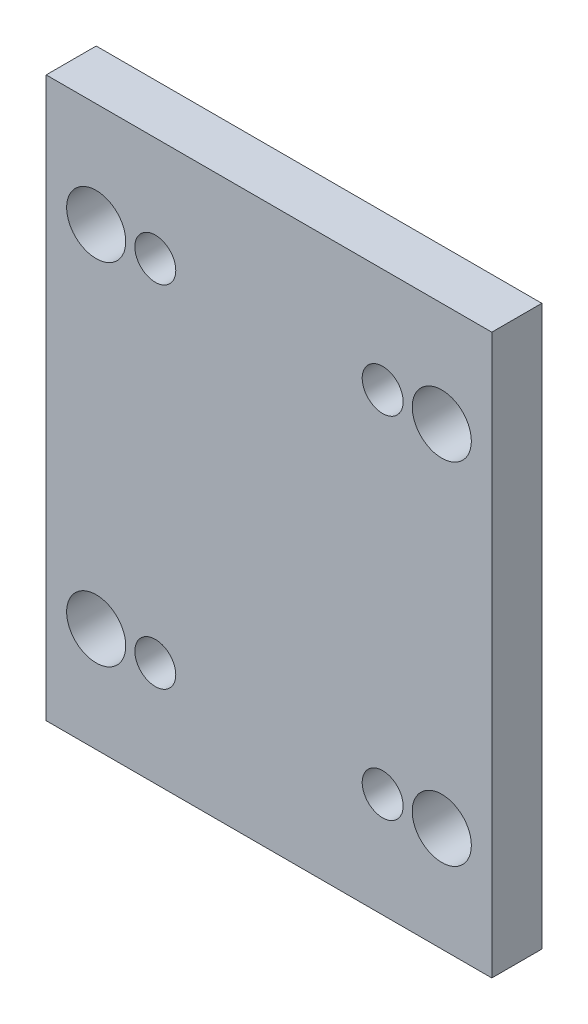
ISO-10303-21;
HEADER;
FILE_DESCRIPTION(('STEP AP214'),'2;1');
FILE_NAME('part.step','',(''),(''),'','','');
FILE_SCHEMA(('AUTOMOTIVE_DESIGN { 1 0 10303 214 1 1 1 1 }'));
ENDSEC;
DATA;
#1=APPLICATION_CONTEXT('core data for automotive mechanical design processes');
#2=APPLICATION_PROTOCOL_DEFINITION('international standard','automotive_design',2000,#1);
#3=PRODUCT_CONTEXT('',#1,'mechanical');
#4=PRODUCT('Part','Part','',(#3));
#5=PRODUCT_RELATED_PRODUCT_CATEGORY('part','',(#4));
#6=PRODUCT_DEFINITION_FORMATION('','',#4);
#7=PRODUCT_DEFINITION_CONTEXT('part definition',#1,'design');
#8=PRODUCT_DEFINITION('design','',#6,#7);
#9=PRODUCT_DEFINITION_SHAPE('','',#8);
#10=(LENGTH_UNIT() NAMED_UNIT(*) SI_UNIT(.MILLI.,.METRE.));
#11=(NAMED_UNIT(*) PLANE_ANGLE_UNIT() SI_UNIT($,.RADIAN.));
#12=(NAMED_UNIT(*) SI_UNIT($,.STERADIAN.) SOLID_ANGLE_UNIT());
#13=UNCERTAINTY_MEASURE_WITH_UNIT(LENGTH_MEASURE(1.E-05),#10,'distance_accuracy_value','');
#14=(GEOMETRIC_REPRESENTATION_CONTEXT(3) GLOBAL_UNCERTAINTY_ASSIGNED_CONTEXT((#13)) GLOBAL_UNIT_ASSIGNED_CONTEXT((#10,
#11,#12)) REPRESENTATION_CONTEXT('',''));
#15=CARTESIAN_POINT('',(0.,0.,0.));
#16=DIRECTION('',(0.,0.,1.));
#17=DIRECTION('',(1.,0.,0.));
#18=AXIS2_PLACEMENT_3D('',#15,#16,#17);
#19=CARTESIAN_POINT('',(98.,-123.,0.));
#20=DIRECTION('',(1.,0.,0.));
#21=DIRECTION('',(0.,0.,-1.));
#22=AXIS2_PLACEMENT_3D('',#19,#20,#21);
#23=PLANE('',#22);
#24=DIRECTION('',(0.,1.,0.));
#25=VECTOR('',#24,1.);
#26=CARTESIAN_POINT('',(98.,-123.,22.));
#27=LINE('',#26,#25);
#28=CARTESIAN_POINT('',(98.,-123.,22.));
#29=VERTEX_POINT('',#28);
#30=CARTESIAN_POINT('',(98.,123.,22.));
#31=VERTEX_POINT('',#30);
#32=EDGE_CURVE('E102',#29,#31,#27,.T.);
#33=ORIENTED_EDGE('',*,*,#32,.F.);
#34=DIRECTION('',(0.,0.,1.));
#35=VECTOR('',#34,1.);
#36=CARTESIAN_POINT('',(98.,-123.,0.));
#37=LINE('',#36,#35);
#38=CARTESIAN_POINT('',(98.,-123.,0.));
#39=VERTEX_POINT('',#38);
#40=EDGE_CURVE('E11',#39,#29,#37,.T.);
#41=ORIENTED_EDGE('',*,*,#40,.F.);
#42=DIRECTION('',(0.,1.,0.));
#43=VECTOR('',#42,1.);
#44=CARTESIAN_POINT('',(98.,-123.,0.));
#45=LINE('',#44,#43);
#46=CARTESIAN_POINT('',(98.,123.,0.));
#47=VERTEX_POINT('',#46);
#48=EDGE_CURVE('E95',#39,#47,#45,.T.);
#49=ORIENTED_EDGE('',*,*,#48,.T.);
#50=DIRECTION('',(0.,0.,1.));
#51=VECTOR('',#50,1.);
#52=CARTESIAN_POINT('',(98.,123.,0.));
#53=LINE('',#52,#51);
#54=EDGE_CURVE('E40',#47,#31,#53,.T.);
#55=ORIENTED_EDGE('',*,*,#54,.T.);
#56=EDGE_LOOP('',(#33,#41,#49,#55));
#57=FACE_BOUND('',#56,.T.);
#58=ADVANCED_FACE('F37',(#57),#23,.T.);
#59=CARTESIAN_POINT('',(-98.,-123.,0.));
#60=DIRECTION('',(0.,-1.,0.));
#61=DIRECTION('',(0.,0.,-1.));
#62=AXIS2_PLACEMENT_3D('',#59,#60,#61);
#63=PLANE('',#62);
#64=DIRECTION('',(1.,0.,0.));
#65=VECTOR('',#64,1.);
#66=CARTESIAN_POINT('',(-98.,-123.,22.));
#67=LINE('',#66,#65);
#68=CARTESIAN_POINT('',(-98.,-123.,22.));
#69=VERTEX_POINT('',#68);
#70=EDGE_CURVE('E97',#69,#29,#67,.T.);
#71=ORIENTED_EDGE('',*,*,#70,.F.);
#72=DIRECTION('',(0.,0.,1.));
#73=VECTOR('',#72,1.);
#74=CARTESIAN_POINT('',(-98.,-123.,0.));
#75=LINE('',#74,#73);
#76=CARTESIAN_POINT('',(-98.,-123.,0.));
#77=VERTEX_POINT('',#76);
#78=EDGE_CURVE('E46',#77,#69,#75,.T.);
#79=ORIENTED_EDGE('',*,*,#78,.F.);
#80=DIRECTION('',(1.,0.,0.));
#81=VECTOR('',#80,1.);
#82=CARTESIAN_POINT('',(-98.,-123.,0.));
#83=LINE('',#82,#81);
#84=EDGE_CURVE('E92',#77,#39,#83,.T.);
#85=ORIENTED_EDGE('',*,*,#84,.T.);
#86=ORIENTED_EDGE('',*,*,#40,.T.);
#87=EDGE_LOOP('',(#71,#79,#85,#86));
#88=FACE_BOUND('',#87,.T.);
#89=ADVANCED_FACE('F113',(#88),#63,.T.);
#90=CARTESIAN_POINT('',(-98.,123.,0.));
#91=DIRECTION('',(-1.,0.,0.));
#92=DIRECTION('',(0.,0.,1.));
#93=AXIS2_PLACEMENT_3D('',#90,#91,#92);
#94=PLANE('',#93);
#95=DIRECTION('',(0.,-1.,0.));
#96=VECTOR('',#95,1.);
#97=CARTESIAN_POINT('',(-98.,123.,22.));
#98=LINE('',#97,#96);
#99=CARTESIAN_POINT('',(-98.,123.,22.));
#100=VERTEX_POINT('',#99);
#101=EDGE_CURVE('E87',#100,#69,#98,.T.);
#102=ORIENTED_EDGE('',*,*,#101,.F.);
#103=DIRECTION('',(0.,0.,1.));
#104=VECTOR('',#103,1.);
#105=CARTESIAN_POINT('',(-98.,123.,0.));
#106=LINE('',#105,#104);
#107=CARTESIAN_POINT('',(-98.,123.,0.));
#108=VERTEX_POINT('',#107);
#109=EDGE_CURVE('E82',#108,#100,#106,.T.);
#110=ORIENTED_EDGE('',*,*,#109,.F.);
#111=DIRECTION('',(0.,-1.,0.));
#112=VECTOR('',#111,1.);
#113=CARTESIAN_POINT('',(-98.,123.,0.));
#114=LINE('',#113,#112);
#115=EDGE_CURVE('E85',#108,#77,#114,.T.);
#116=ORIENTED_EDGE('',*,*,#115,.T.);
#117=ORIENTED_EDGE('',*,*,#78,.T.);
#118=EDGE_LOOP('',(#102,#110,#116,#117));
#119=FACE_BOUND('',#118,.T.);
#120=ADVANCED_FACE('F84',(#119),#94,.T.);
#121=CARTESIAN_POINT('',(98.,123.,0.));
#122=DIRECTION('',(0.,1.,0.));
#123=DIRECTION('',(0.,0.,1.));
#124=AXIS2_PLACEMENT_3D('',#121,#122,#123);
#125=PLANE('',#124);
#126=DIRECTION('',(-1.,0.,0.));
#127=VECTOR('',#126,1.);
#128=CARTESIAN_POINT('',(98.,123.,22.));
#129=LINE('',#128,#127);
#130=EDGE_CURVE('E105',#31,#100,#129,.T.);
#131=ORIENTED_EDGE('',*,*,#130,.F.);
#132=ORIENTED_EDGE('',*,*,#54,.F.);
#133=DIRECTION('',(-1.,0.,0.));
#134=VECTOR('',#133,1.);
#135=CARTESIAN_POINT('',(98.,123.,0.));
#136=LINE('',#135,#134);
#137=EDGE_CURVE('E91',#47,#108,#136,.T.);
#138=ORIENTED_EDGE('',*,*,#137,.T.);
#139=ORIENTED_EDGE('',*,*,#109,.T.);
#140=EDGE_LOOP('',(#131,#132,#138,#139));
#141=FACE_BOUND('',#140,.T.);
#142=ADVANCED_FACE('F94',(#141),#125,.T.);
#143=CARTESIAN_POINT('',(0.,0.,0.));
#144=DIRECTION('',(0.,0.,1.));
#145=DIRECTION('',(1.,0.,0.));
#146=AXIS2_PLACEMENT_3D('',#143,#144,#145);
#147=PLANE('',#146);
#148=CARTESIAN_POINT('',(76.,77.,0.));
#149=DIRECTION('',(0.,0.,1.));
#150=DIRECTION('',(1.,0.,0.));
#151=AXIS2_PLACEMENT_3D('',#148,#149,#150);
#152=CIRCLE('',#151,13.);
#153=CARTESIAN_POINT('',(89.,77.,0.));
#154=VERTEX_POINT('',#153);
#155=EDGE_CURVE('E202',#154,#154,#152,.T.);
#156=ORIENTED_EDGE('',*,*,#155,.T.);
#157=EDGE_LOOP('',(#156));
#158=FACE_BOUND('',#157,.T.);
#159=CARTESIAN_POINT('',(76.,-77.,0.));
#160=DIRECTION('',(0.,0.,1.));
#161=DIRECTION('',(1.,0.,0.));
#162=AXIS2_PLACEMENT_3D('',#159,#160,#161);
#163=CIRCLE('',#162,13.);
#164=CARTESIAN_POINT('',(89.,-77.,0.));
#165=VERTEX_POINT('',#164);
#166=EDGE_CURVE('E212',#165,#165,#163,.T.);
#167=ORIENTED_EDGE('',*,*,#166,.T.);
#168=EDGE_LOOP('',(#167));
#169=FACE_BOUND('',#168,.T.);
#170=CARTESIAN_POINT('',(-76.,-77.,0.));
#171=DIRECTION('',(0.,0.,1.));
#172=DIRECTION('',(1.,0.,0.));
#173=AXIS2_PLACEMENT_3D('',#170,#171,#172);
#174=CIRCLE('',#173,13.);
#175=CARTESIAN_POINT('',(-63.,-77.,0.));
#176=VERTEX_POINT('',#175);
#177=EDGE_CURVE('E218',#176,#176,#174,.T.);
#178=ORIENTED_EDGE('',*,*,#177,.T.);
#179=EDGE_LOOP('',(#178));
#180=FACE_BOUND('',#179,.T.);
#181=CARTESIAN_POINT('',(-76.,77.,0.));
#182=DIRECTION('',(0.,0.,1.));
#183=DIRECTION('',(1.,0.,0.));
#184=AXIS2_PLACEMENT_3D('',#181,#182,#183);
#185=CIRCLE('',#184,13.);
#186=CARTESIAN_POINT('',(-63.,77.,0.));
#187=VERTEX_POINT('',#186);
#188=EDGE_CURVE('E224',#187,#187,#185,.T.);
#189=ORIENTED_EDGE('',*,*,#188,.T.);
#190=EDGE_LOOP('',(#189));
#191=FACE_BOUND('',#190,.T.);
#192=CARTESIAN_POINT('',(50.,77.,0.));
#193=DIRECTION('',(0.,0.,1.));
#194=DIRECTION('',(1.,0.,0.));
#195=AXIS2_PLACEMENT_3D('',#192,#193,#194);
#196=CIRCLE('',#195,5.50000000000001);
#197=CARTESIAN_POINT('',(55.5,77.,0.));
#198=VERTEX_POINT('',#197);
#199=EDGE_CURVE('E236',#198,#198,#196,.T.);
#200=ORIENTED_EDGE('',*,*,#199,.T.);
#201=EDGE_LOOP('',(#200));
#202=FACE_BOUND('',#201,.T.);
#203=CARTESIAN_POINT('',(50.,-77.,0.));
#204=DIRECTION('',(0.,0.,1.));
#205=DIRECTION('',(1.,0.,0.));
#206=AXIS2_PLACEMENT_3D('',#203,#204,#205);
#207=CIRCLE('',#206,5.50000000000001);
#208=CARTESIAN_POINT('',(55.5,-77.,0.));
#209=VERTEX_POINT('',#208);
#210=EDGE_CURVE('E248',#209,#209,#207,.T.);
#211=ORIENTED_EDGE('',*,*,#210,.T.);
#212=EDGE_LOOP('',(#211));
#213=FACE_BOUND('',#212,.T.);
#214=CARTESIAN_POINT('',(-50.,77.,0.));
#215=DIRECTION('',(0.,0.,1.));
#216=DIRECTION('',(1.,0.,0.));
#217=AXIS2_PLACEMENT_3D('',#214,#215,#216);
#218=CIRCLE('',#217,5.50000000000001);
#219=CARTESIAN_POINT('',(-44.5,77.,0.));
#220=VERTEX_POINT('',#219);
#221=EDGE_CURVE('E260',#220,#220,#218,.T.);
#222=ORIENTED_EDGE('',*,*,#221,.T.);
#223=EDGE_LOOP('',(#222));
#224=FACE_BOUND('',#223,.T.);
#225=CARTESIAN_POINT('',(-50.,-77.,0.));
#226=DIRECTION('',(0.,0.,1.));
#227=DIRECTION('',(1.,0.,0.));
#228=AXIS2_PLACEMENT_3D('',#225,#226,#227);
#229=CIRCLE('',#228,5.50000000000001);
#230=CARTESIAN_POINT('',(-44.5,-77.,0.));
#231=VERTEX_POINT('',#230);
#232=EDGE_CURVE('E106',#231,#231,#229,.T.);
#233=ORIENTED_EDGE('',*,*,#232,.T.);
#234=EDGE_LOOP('',(#233));
#235=FACE_BOUND('',#234,.T.);
#236=ORIENTED_EDGE('',*,*,#48,.F.);
#237=ORIENTED_EDGE('',*,*,#84,.F.);
#238=ORIENTED_EDGE('',*,*,#115,.F.);
#239=ORIENTED_EDGE('',*,*,#137,.F.);
#240=EDGE_LOOP('',(#236,#237,#238,#239));
#241=FACE_BOUND('',#240,.T.);
#242=ADVANCED_FACE('F90',(#158,#169,#180,#191,#202,#213,#224,#235,#241),#147,.F.);
#243=CARTESIAN_POINT('',(0.,0.,22.));
#244=DIRECTION('',(0.,0.,1.));
#245=DIRECTION('',(1.,0.,0.));
#246=AXIS2_PLACEMENT_3D('',#243,#244,#245);
#247=PLANE('',#246);
#248=CARTESIAN_POINT('',(76.,77.,22.));
#249=DIRECTION('',(0.,0.,1.));
#250=DIRECTION('',(1.,0.,0.));
#251=AXIS2_PLACEMENT_3D('',#248,#249,#250);
#252=CIRCLE('',#251,13.);
#253=CARTESIAN_POINT('',(89.,77.,22.));
#254=VERTEX_POINT('',#253);
#255=EDGE_CURVE('E205',#254,#254,#252,.T.);
#256=ORIENTED_EDGE('',*,*,#255,.F.);
#257=EDGE_LOOP('',(#256));
#258=FACE_BOUND('',#257,.T.);
#259=CARTESIAN_POINT('',(76.,-77.,22.));
#260=DIRECTION('',(0.,0.,1.));
#261=DIRECTION('',(1.,0.,0.));
#262=AXIS2_PLACEMENT_3D('',#259,#260,#261);
#263=CIRCLE('',#262,13.);
#264=CARTESIAN_POINT('',(89.,-77.,22.));
#265=VERTEX_POINT('',#264);
#266=EDGE_CURVE('E207',#265,#265,#263,.T.);
#267=ORIENTED_EDGE('',*,*,#266,.F.);
#268=EDGE_LOOP('',(#267));
#269=FACE_BOUND('',#268,.T.);
#270=CARTESIAN_POINT('',(-76.,-77.,22.));
#271=DIRECTION('',(0.,0.,1.));
#272=DIRECTION('',(1.,0.,0.));
#273=AXIS2_PLACEMENT_3D('',#270,#271,#272);
#274=CIRCLE('',#273,13.);
#275=CARTESIAN_POINT('',(-63.,-77.,22.));
#276=VERTEX_POINT('',#275);
#277=EDGE_CURVE('E215',#276,#276,#274,.T.);
#278=ORIENTED_EDGE('',*,*,#277,.F.);
#279=EDGE_LOOP('',(#278));
#280=FACE_BOUND('',#279,.T.);
#281=CARTESIAN_POINT('',(-76.,77.,22.));
#282=DIRECTION('',(0.,0.,1.));
#283=DIRECTION('',(1.,0.,0.));
#284=AXIS2_PLACEMENT_3D('',#281,#282,#283);
#285=CIRCLE('',#284,13.);
#286=CARTESIAN_POINT('',(-63.,77.,22.));
#287=VERTEX_POINT('',#286);
#288=EDGE_CURVE('E221',#287,#287,#285,.T.);
#289=ORIENTED_EDGE('',*,*,#288,.F.);
#290=EDGE_LOOP('',(#289));
#291=FACE_BOUND('',#290,.T.);
#292=CARTESIAN_POINT('',(50.,77.,22.));
#293=DIRECTION('',(0.,0.,1.));
#294=DIRECTION('',(1.,0.,0.));
#295=AXIS2_PLACEMENT_3D('',#292,#293,#294);
#296=CIRCLE('',#295,8.99999999999999);
#297=CARTESIAN_POINT('',(59.,77.,22.));
#298=VERTEX_POINT('',#297);
#299=EDGE_CURVE('E227',#298,#298,#296,.T.);
#300=ORIENTED_EDGE('',*,*,#299,.F.);
#301=EDGE_LOOP('',(#300));
#302=FACE_BOUND('',#301,.T.);
#303=CARTESIAN_POINT('',(50.,-77.,22.));
#304=DIRECTION('',(0.,0.,1.));
#305=DIRECTION('',(1.,0.,0.));
#306=AXIS2_PLACEMENT_3D('',#303,#304,#305);
#307=CIRCLE('',#306,8.99999999999999);
#308=CARTESIAN_POINT('',(59.,-77.,22.));
#309=VERTEX_POINT('',#308);
#310=EDGE_CURVE('E239',#309,#309,#307,.T.);
#311=ORIENTED_EDGE('',*,*,#310,.F.);
#312=EDGE_LOOP('',(#311));
#313=FACE_BOUND('',#312,.T.);
#314=CARTESIAN_POINT('',(-50.,77.,22.));
#315=DIRECTION('',(0.,0.,1.));
#316=DIRECTION('',(1.,0.,0.));
#317=AXIS2_PLACEMENT_3D('',#314,#315,#316);
#318=CIRCLE('',#317,8.99999999999999);
#319=CARTESIAN_POINT('',(-41.,77.,22.));
#320=VERTEX_POINT('',#319);
#321=EDGE_CURVE('E251',#320,#320,#318,.T.);
#322=ORIENTED_EDGE('',*,*,#321,.F.);
#323=EDGE_LOOP('',(#322));
#324=FACE_BOUND('',#323,.T.);
#325=CARTESIAN_POINT('',(-50.,-77.,22.));
#326=DIRECTION('',(0.,0.,1.));
#327=DIRECTION('',(1.,0.,0.));
#328=AXIS2_PLACEMENT_3D('',#325,#326,#327);
#329=CIRCLE('',#328,8.99999999999999);
#330=CARTESIAN_POINT('',(-41.,-77.,22.));
#331=VERTEX_POINT('',#330);
#332=EDGE_CURVE('E263',#331,#331,#329,.T.);
#333=ORIENTED_EDGE('',*,*,#332,.F.);
#334=EDGE_LOOP('',(#333));
#335=FACE_BOUND('',#334,.T.);
#336=ORIENTED_EDGE('',*,*,#32,.T.);
#337=ORIENTED_EDGE('',*,*,#130,.T.);
#338=ORIENTED_EDGE('',*,*,#101,.T.);
#339=ORIENTED_EDGE('',*,*,#70,.T.);
#340=EDGE_LOOP('',(#336,#337,#338,#339));
#341=FACE_BOUND('',#340,.T.);
#342=ADVANCED_FACE('F112',(#258,#269,#280,#291,#302,#313,#324,#335,#341),#247,.T.);
#343=CARTESIAN_POINT('',(-50.,-77.,22.));
#344=DIRECTION('',(0.,0.,1.));
#345=DIRECTION('',(1.,0.,0.));
#346=AXIS2_PLACEMENT_3D('',#343,#344,#345);
#347=CYLINDRICAL_SURFACE('',#346,5.50000000000001);
#348=ORIENTED_EDGE('',*,*,#232,.F.);
#349=EDGE_LOOP('',(#348));
#350=FACE_BOUND('',#349,.T.);
#351=CARTESIAN_POINT('',(-50.,-77.,9.));
#352=DIRECTION('',(0.,0.,1.));
#353=DIRECTION('',(1.,0.,0.));
#354=AXIS2_PLACEMENT_3D('',#351,#352,#353);
#355=CIRCLE('',#354,5.50000000000001);
#356=CARTESIAN_POINT('',(-44.5,-77.,9.));
#357=VERTEX_POINT('',#356);
#358=EDGE_CURVE('E269',#357,#357,#355,.T.);
#359=ORIENTED_EDGE('',*,*,#358,.T.);
#360=EDGE_LOOP('',(#359));
#361=FACE_BOUND('',#360,.T.);
#362=ADVANCED_FACE('F131',(#350,#361),#347,.F.);
#363=CARTESIAN_POINT('',(-44.5,-77.,9.));
#364=DIRECTION('',(0.,0.,-1.));
#365=DIRECTION('',(-1.,0.,0.));
#366=AXIS2_PLACEMENT_3D('',#363,#364,#365);
#367=PLANE('',#366);
#368=ORIENTED_EDGE('',*,*,#358,.F.);
#369=EDGE_LOOP('',(#368));
#370=FACE_BOUND('',#369,.T.);
#371=CARTESIAN_POINT('',(-50.,-77.,9.));
#372=DIRECTION('',(0.,0.,1.));
#373=DIRECTION('',(1.,0.,0.));
#374=AXIS2_PLACEMENT_3D('',#371,#372,#373);
#375=CIRCLE('',#374,8.99999999999999);
#376=CARTESIAN_POINT('',(-41.,-77.,9.));
#377=VERTEX_POINT('',#376);
#378=EDGE_CURVE('E266',#377,#377,#375,.T.);
#379=ORIENTED_EDGE('',*,*,#378,.T.);
#380=EDGE_LOOP('',(#379));
#381=FACE_BOUND('',#380,.T.);
#382=ADVANCED_FACE('F138',(#370,#381),#367,.F.);
#383=CARTESIAN_POINT('',(-50.,-77.,22.));
#384=DIRECTION('',(0.,0.,1.));
#385=DIRECTION('',(1.,0.,0.));
#386=AXIS2_PLACEMENT_3D('',#383,#384,#385);
#387=CYLINDRICAL_SURFACE('',#386,8.99999999999999);
#388=ORIENTED_EDGE('',*,*,#378,.F.);
#389=EDGE_LOOP('',(#388));
#390=FACE_BOUND('',#389,.T.);
#391=ORIENTED_EDGE('',*,*,#332,.T.);
#392=EDGE_LOOP('',(#391));
#393=FACE_BOUND('',#392,.T.);
#394=ADVANCED_FACE('F142',(#390,#393),#387,.F.);
#395=CARTESIAN_POINT('',(-50.,77.,22.));
#396=DIRECTION('',(0.,0.,1.));
#397=DIRECTION('',(1.,0.,0.));
#398=AXIS2_PLACEMENT_3D('',#395,#396,#397);
#399=CYLINDRICAL_SURFACE('',#398,5.50000000000001);
#400=ORIENTED_EDGE('',*,*,#221,.F.);
#401=EDGE_LOOP('',(#400));
#402=FACE_BOUND('',#401,.T.);
#403=CARTESIAN_POINT('',(-50.,77.,9.));
#404=DIRECTION('',(0.,0.,1.));
#405=DIRECTION('',(1.,0.,0.));
#406=AXIS2_PLACEMENT_3D('',#403,#404,#405);
#407=CIRCLE('',#406,5.50000000000001);
#408=CARTESIAN_POINT('',(-44.5,77.,9.));
#409=VERTEX_POINT('',#408);
#410=EDGE_CURVE('E257',#409,#409,#407,.T.);
#411=ORIENTED_EDGE('',*,*,#410,.T.);
#412=EDGE_LOOP('',(#411));
#413=FACE_BOUND('',#412,.T.);
#414=ADVANCED_FACE('F146',(#402,#413),#399,.F.);
#415=CARTESIAN_POINT('',(-44.5,77.,9.));
#416=DIRECTION('',(0.,0.,-1.));
#417=DIRECTION('',(-1.,0.,0.));
#418=AXIS2_PLACEMENT_3D('',#415,#416,#417);
#419=PLANE('',#418);
#420=ORIENTED_EDGE('',*,*,#410,.F.);
#421=EDGE_LOOP('',(#420));
#422=FACE_BOUND('',#421,.T.);
#423=CARTESIAN_POINT('',(-50.,77.,9.));
#424=DIRECTION('',(0.,0.,1.));
#425=DIRECTION('',(1.,0.,0.));
#426=AXIS2_PLACEMENT_3D('',#423,#424,#425);
#427=CIRCLE('',#426,8.99999999999999);
#428=CARTESIAN_POINT('',(-41.,77.,9.));
#429=VERTEX_POINT('',#428);
#430=EDGE_CURVE('E254',#429,#429,#427,.T.);
#431=ORIENTED_EDGE('',*,*,#430,.T.);
#432=EDGE_LOOP('',(#431));
#433=FACE_BOUND('',#432,.T.);
#434=ADVANCED_FACE('F150',(#422,#433),#419,.F.);
#435=CARTESIAN_POINT('',(-50.,77.,22.));
#436=DIRECTION('',(0.,0.,1.));
#437=DIRECTION('',(1.,0.,0.));
#438=AXIS2_PLACEMENT_3D('',#435,#436,#437);
#439=CYLINDRICAL_SURFACE('',#438,8.99999999999999);
#440=ORIENTED_EDGE('',*,*,#430,.F.);
#441=EDGE_LOOP('',(#440));
#442=FACE_BOUND('',#441,.T.);
#443=ORIENTED_EDGE('',*,*,#321,.T.);
#444=EDGE_LOOP('',(#443));
#445=FACE_BOUND('',#444,.T.);
#446=ADVANCED_FACE('F154',(#442,#445),#439,.F.);
#447=CARTESIAN_POINT('',(50.,-77.,22.));
#448=DIRECTION('',(0.,0.,1.));
#449=DIRECTION('',(1.,0.,0.));
#450=AXIS2_PLACEMENT_3D('',#447,#448,#449);
#451=CYLINDRICAL_SURFACE('',#450,5.50000000000001);
#452=ORIENTED_EDGE('',*,*,#210,.F.);
#453=EDGE_LOOP('',(#452));
#454=FACE_BOUND('',#453,.T.);
#455=CARTESIAN_POINT('',(50.,-77.,9.));
#456=DIRECTION('',(0.,0.,1.));
#457=DIRECTION('',(1.,0.,0.));
#458=AXIS2_PLACEMENT_3D('',#455,#456,#457);
#459=CIRCLE('',#458,5.50000000000001);
#460=CARTESIAN_POINT('',(55.5,-77.,9.));
#461=VERTEX_POINT('',#460);
#462=EDGE_CURVE('E245',#461,#461,#459,.T.);
#463=ORIENTED_EDGE('',*,*,#462,.T.);
#464=EDGE_LOOP('',(#463));
#465=FACE_BOUND('',#464,.T.);
#466=ADVANCED_FACE('F158',(#454,#465),#451,.F.);
#467=CARTESIAN_POINT('',(55.5,-77.,9.));
#468=DIRECTION('',(0.,0.,-1.));
#469=DIRECTION('',(-1.,0.,0.));
#470=AXIS2_PLACEMENT_3D('',#467,#468,#469);
#471=PLANE('',#470);
#472=ORIENTED_EDGE('',*,*,#462,.F.);
#473=EDGE_LOOP('',(#472));
#474=FACE_BOUND('',#473,.T.);
#475=CARTESIAN_POINT('',(50.,-77.,9.));
#476=DIRECTION('',(0.,0.,1.));
#477=DIRECTION('',(1.,0.,0.));
#478=AXIS2_PLACEMENT_3D('',#475,#476,#477);
#479=CIRCLE('',#478,8.99999999999999);
#480=CARTESIAN_POINT('',(59.,-77.,9.));
#481=VERTEX_POINT('',#480);
#482=EDGE_CURVE('E242',#481,#481,#479,.T.);
#483=ORIENTED_EDGE('',*,*,#482,.T.);
#484=EDGE_LOOP('',(#483));
#485=FACE_BOUND('',#484,.T.);
#486=ADVANCED_FACE('F162',(#474,#485),#471,.F.);
#487=CARTESIAN_POINT('',(50.,-77.,22.));
#488=DIRECTION('',(0.,0.,1.));
#489=DIRECTION('',(1.,0.,0.));
#490=AXIS2_PLACEMENT_3D('',#487,#488,#489);
#491=CYLINDRICAL_SURFACE('',#490,8.99999999999999);
#492=ORIENTED_EDGE('',*,*,#482,.F.);
#493=EDGE_LOOP('',(#492));
#494=FACE_BOUND('',#493,.T.);
#495=ORIENTED_EDGE('',*,*,#310,.T.);
#496=EDGE_LOOP('',(#495));
#497=FACE_BOUND('',#496,.T.);
#498=ADVANCED_FACE('F166',(#494,#497),#491,.F.);
#499=CARTESIAN_POINT('',(50.,77.,22.));
#500=DIRECTION('',(0.,0.,1.));
#501=DIRECTION('',(1.,0.,0.));
#502=AXIS2_PLACEMENT_3D('',#499,#500,#501);
#503=CYLINDRICAL_SURFACE('',#502,5.50000000000001);
#504=ORIENTED_EDGE('',*,*,#199,.F.);
#505=EDGE_LOOP('',(#504));
#506=FACE_BOUND('',#505,.T.);
#507=CARTESIAN_POINT('',(50.,77.,9.));
#508=DIRECTION('',(0.,0.,1.));
#509=DIRECTION('',(1.,0.,0.));
#510=AXIS2_PLACEMENT_3D('',#507,#508,#509);
#511=CIRCLE('',#510,5.50000000000001);
#512=CARTESIAN_POINT('',(55.5,77.,9.));
#513=VERTEX_POINT('',#512);
#514=EDGE_CURVE('E233',#513,#513,#511,.T.);
#515=ORIENTED_EDGE('',*,*,#514,.T.);
#516=EDGE_LOOP('',(#515));
#517=FACE_BOUND('',#516,.T.);
#518=ADVANCED_FACE('F170',(#506,#517),#503,.F.);
#519=CARTESIAN_POINT('',(55.5,77.,9.));
#520=DIRECTION('',(0.,0.,-1.));
#521=DIRECTION('',(-1.,0.,0.));
#522=AXIS2_PLACEMENT_3D('',#519,#520,#521);
#523=PLANE('',#522);
#524=ORIENTED_EDGE('',*,*,#514,.F.);
#525=EDGE_LOOP('',(#524));
#526=FACE_BOUND('',#525,.T.);
#527=CARTESIAN_POINT('',(50.,77.,9.));
#528=DIRECTION('',(0.,0.,1.));
#529=DIRECTION('',(1.,0.,0.));
#530=AXIS2_PLACEMENT_3D('',#527,#528,#529);
#531=CIRCLE('',#530,8.99999999999999);
#532=CARTESIAN_POINT('',(59.,77.,9.));
#533=VERTEX_POINT('',#532);
#534=EDGE_CURVE('E230',#533,#533,#531,.T.);
#535=ORIENTED_EDGE('',*,*,#534,.T.);
#536=EDGE_LOOP('',(#535));
#537=FACE_BOUND('',#536,.T.);
#538=ADVANCED_FACE('F174',(#526,#537),#523,.F.);
#539=CARTESIAN_POINT('',(50.,77.,22.));
#540=DIRECTION('',(0.,0.,1.));
#541=DIRECTION('',(1.,0.,0.));
#542=AXIS2_PLACEMENT_3D('',#539,#540,#541);
#543=CYLINDRICAL_SURFACE('',#542,8.99999999999999);
#544=ORIENTED_EDGE('',*,*,#534,.F.);
#545=EDGE_LOOP('',(#544));
#546=FACE_BOUND('',#545,.T.);
#547=ORIENTED_EDGE('',*,*,#299,.T.);
#548=EDGE_LOOP('',(#547));
#549=FACE_BOUND('',#548,.T.);
#550=ADVANCED_FACE('F178',(#546,#549),#543,.F.);
#551=CARTESIAN_POINT('',(-76.,77.,22.));
#552=DIRECTION('',(0.,0.,1.));
#553=DIRECTION('',(1.,0.,0.));
#554=AXIS2_PLACEMENT_3D('',#551,#552,#553);
#555=CYLINDRICAL_SURFACE('',#554,13.);
#556=ORIENTED_EDGE('',*,*,#188,.F.);
#557=EDGE_LOOP('',(#556));
#558=FACE_BOUND('',#557,.T.);
#559=ORIENTED_EDGE('',*,*,#288,.T.);
#560=EDGE_LOOP('',(#559));
#561=FACE_BOUND('',#560,.T.);
#562=ADVANCED_FACE('F182',(#558,#561),#555,.F.);
#563=CARTESIAN_POINT('',(-76.,-77.,22.));
#564=DIRECTION('',(0.,0.,1.));
#565=DIRECTION('',(1.,0.,0.));
#566=AXIS2_PLACEMENT_3D('',#563,#564,#565);
#567=CYLINDRICAL_SURFACE('',#566,13.);
#568=ORIENTED_EDGE('',*,*,#177,.F.);
#569=EDGE_LOOP('',(#568));
#570=FACE_BOUND('',#569,.T.);
#571=ORIENTED_EDGE('',*,*,#277,.T.);
#572=EDGE_LOOP('',(#571));
#573=FACE_BOUND('',#572,.T.);
#574=ADVANCED_FACE('F186',(#570,#573),#567,.F.);
#575=CARTESIAN_POINT('',(76.,-77.,22.));
#576=DIRECTION('',(0.,0.,1.));
#577=DIRECTION('',(1.,0.,0.));
#578=AXIS2_PLACEMENT_3D('',#575,#576,#577);
#579=CYLINDRICAL_SURFACE('',#578,13.);
#580=ORIENTED_EDGE('',*,*,#166,.F.);
#581=EDGE_LOOP('',(#580));
#582=FACE_BOUND('',#581,.T.);
#583=ORIENTED_EDGE('',*,*,#266,.T.);
#584=EDGE_LOOP('',(#583));
#585=FACE_BOUND('',#584,.T.);
#586=ADVANCED_FACE('F190',(#582,#585),#579,.F.);
#587=CARTESIAN_POINT('',(76.,77.,22.));
#588=DIRECTION('',(0.,0.,1.));
#589=DIRECTION('',(1.,0.,0.));
#590=AXIS2_PLACEMENT_3D('',#587,#588,#589);
#591=CYLINDRICAL_SURFACE('',#590,13.);
#592=ORIENTED_EDGE('',*,*,#155,.F.);
#593=EDGE_LOOP('',(#592));
#594=FACE_BOUND('',#593,.T.);
#595=ORIENTED_EDGE('',*,*,#255,.T.);
#596=EDGE_LOOP('',(#595));
#597=FACE_BOUND('',#596,.T.);
#598=ADVANCED_FACE('F194',(#594,#597),#591,.F.);
#599=CLOSED_SHELL('',(#58,#89,#120,#142,#242,#342,#362,#382,#394,#414,#434,#446,#466,#486,#498,
#518,#538,#550,#562,#574,#586,#598));
#600=MANIFOLD_SOLID_BREP('B2',#599);
#601=ADVANCED_BREP_SHAPE_REPRESENTATION('',(#18,#600),#14);
#602=SHAPE_DEFINITION_REPRESENTATION(#9,#601);
ENDSEC;
END-ISO-10303-21;
